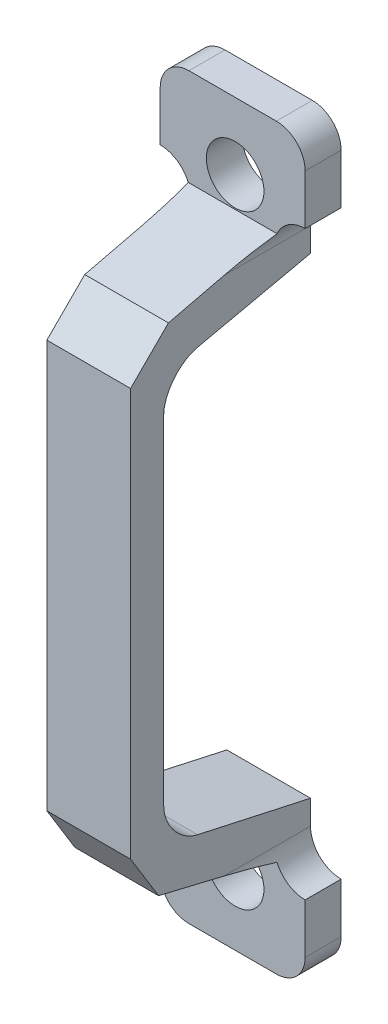
ISO-10303-21;
HEADER;
FILE_DESCRIPTION(('STEP AP214'),'2;1');
FILE_NAME('part.step','',(''),(''),'','','');
FILE_SCHEMA(('AUTOMOTIVE_DESIGN { 1 0 10303 214 1 1 1 1 }'));
ENDSEC;
DATA;
#1=APPLICATION_CONTEXT('core data for automotive mechanical design processes');
#2=APPLICATION_PROTOCOL_DEFINITION('international standard','automotive_design',2000,#1);
#3=PRODUCT_CONTEXT('',#1,'mechanical');
#4=PRODUCT('Part','Part','',(#3));
#5=PRODUCT_RELATED_PRODUCT_CATEGORY('part','',(#4));
#6=PRODUCT_DEFINITION_FORMATION('','',#4);
#7=PRODUCT_DEFINITION_CONTEXT('part definition',#1,'design');
#8=PRODUCT_DEFINITION('design','',#6,#7);
#9=PRODUCT_DEFINITION_SHAPE('','',#8);
#10=(LENGTH_UNIT() NAMED_UNIT(*) SI_UNIT(.MILLI.,.METRE.));
#11=(NAMED_UNIT(*) PLANE_ANGLE_UNIT() SI_UNIT($,.RADIAN.));
#12=(NAMED_UNIT(*) SI_UNIT($,.STERADIAN.) SOLID_ANGLE_UNIT());
#13=UNCERTAINTY_MEASURE_WITH_UNIT(LENGTH_MEASURE(1.E-05),#10,'distance_accuracy_value','');
#14=(GEOMETRIC_REPRESENTATION_CONTEXT(3) GLOBAL_UNCERTAINTY_ASSIGNED_CONTEXT((#13)) GLOBAL_UNIT_ASSIGNED_CONTEXT((#10,
#11,#12)) REPRESENTATION_CONTEXT('',''));
#15=CARTESIAN_POINT('',(0.,0.,0.));
#16=DIRECTION('',(0.,0.,1.));
#17=DIRECTION('',(1.,0.,0.));
#18=AXIS2_PLACEMENT_3D('',#15,#16,#17);
#19=CARTESIAN_POINT('',(89.4859388192383,-29.3519291826514,2.5));
#20=DIRECTION('',(-1.,0.,0.));
#21=DIRECTION('',(0.,0.,1.));
#22=AXIS2_PLACEMENT_3D('',#19,#20,#21);
#23=PLANE('',#22);
#24=DIRECTION('',(0.,1.,0.));
#25=VECTOR('',#24,1.);
#26=CARTESIAN_POINT('',(89.4859388192383,-29.3519291826514,0.));
#27=LINE('',#26,#25);
#28=CARTESIAN_POINT('',(89.4859388192383,-34.8147763907918,0.));
#29=VERTEX_POINT('',#28);
#30=CARTESIAN_POINT('',(89.4859388192383,-31.3519291826514,0.));
#31=VERTEX_POINT('',#30);
#32=EDGE_CURVE('E392',#29,#31,#27,.T.);
#33=ORIENTED_EDGE('',*,*,#32,.T.);
#34=DIRECTION('',(0.,0.,-1.));
#35=VECTOR('',#34,1.);
#36=CARTESIAN_POINT('',(89.4859388192383,-31.3519291826514,2.5));
#37=LINE('',#36,#35);
#38=CARTESIAN_POINT('',(89.4859388192383,-31.3519291826514,2.5));
#39=VERTEX_POINT('',#38);
#40=EDGE_CURVE('E541',#31,#39,#37,.F.);
#41=ORIENTED_EDGE('',*,*,#40,.T.);
#42=DIRECTION('',(0.,1.,0.));
#43=VECTOR('',#42,1.);
#44=CARTESIAN_POINT('',(89.4859388192383,-29.3519291826514,2.5));
#45=LINE('',#44,#43);
#46=CARTESIAN_POINT('',(89.4859388192383,-34.8147763907918,2.5));
#47=VERTEX_POINT('',#46);
#48=EDGE_CURVE('E398',#47,#39,#45,.T.);
#49=ORIENTED_EDGE('',*,*,#48,.F.);
#50=DIRECTION('',(0.,0.,1.));
#51=VECTOR('',#50,1.);
#52=CARTESIAN_POINT('',(89.4859388192383,-34.8147763907918,0.));
#53=LINE('',#52,#51);
#54=EDGE_CURVE('E362',#47,#29,#53,.F.);
#55=ORIENTED_EDGE('',*,*,#54,.T.);
#56=EDGE_LOOP('',(#33,#41,#49,#55));
#57=FACE_BOUND('',#56,.T.);
#58=ADVANCED_FACE('F41',(#57),#23,.F.);
#59=CARTESIAN_POINT('',(79.4177304575605,-29.3519291826514,2.5));
#60=DIRECTION('',(1.,0.,0.));
#61=DIRECTION('',(0.,0.,-1.));
#62=AXIS2_PLACEMENT_3D('',#59,#60,#61);
#63=PLANE('',#62);
#64=DIRECTION('',(0.,-1.,0.));
#65=VECTOR('',#64,1.);
#66=CARTESIAN_POINT('',(79.4177304575605,-29.3519291826514,2.5));
#67=LINE('',#66,#65);
#68=CARTESIAN_POINT('',(79.4177304575605,-31.3519291826514,2.5));
#69=VERTEX_POINT('',#68);
#70=CARTESIAN_POINT('',(79.4177304575605,-34.8147763907918,2.5));
#71=VERTEX_POINT('',#70);
#72=EDGE_CURVE('E402',#69,#71,#67,.T.);
#73=ORIENTED_EDGE('',*,*,#72,.F.);
#74=DIRECTION('',(0.,0.,-1.));
#75=VECTOR('',#74,1.);
#76=CARTESIAN_POINT('',(79.4177304575605,-31.3519291826514,2.5));
#77=LINE('',#76,#75);
#78=CARTESIAN_POINT('',(79.4177304575605,-31.3519291826514,0.));
#79=VERTEX_POINT('',#78);
#80=EDGE_CURVE('E547',#69,#79,#77,.T.);
#81=ORIENTED_EDGE('',*,*,#80,.T.);
#82=DIRECTION('',(0.,-1.,0.));
#83=VECTOR('',#82,1.);
#84=CARTESIAN_POINT('',(79.4177304575605,-29.3519291826514,0.));
#85=LINE('',#84,#83);
#86=CARTESIAN_POINT('',(79.4177304575605,-34.8147763907918,0.));
#87=VERTEX_POINT('',#86);
#88=EDGE_CURVE('E413',#79,#87,#85,.T.);
#89=ORIENTED_EDGE('',*,*,#88,.T.);
#90=DIRECTION('',(0.,0.,1.));
#91=VECTOR('',#90,1.);
#92=CARTESIAN_POINT('',(79.4177304575605,-34.8147763907918,0.));
#93=LINE('',#92,#91);
#94=EDGE_CURVE('E368',#87,#71,#93,.T.);
#95=ORIENTED_EDGE('',*,*,#94,.T.);
#96=EDGE_LOOP('',(#73,#81,#89,#95));
#97=FACE_BOUND('',#96,.T.);
#98=ADVANCED_FACE('F670',(#97),#63,.F.);
#99=CARTESIAN_POINT('',(0.,0.,0.));
#100=DIRECTION('',(0.,0.,1.));
#101=DIRECTION('',(1.,0.,0.));
#102=AXIS2_PLACEMENT_3D('',#99,#100,#101);
#103=PLANE('',#102);
#104=CARTESIAN_POINT('',(84.6238698537211,-34.0071015964445,0.));
#105=DIRECTION('',(0.,0.,1.));
#106=DIRECTION('',(1.,0.,0.));
#107=AXIS2_PLACEMENT_3D('',#104,#105,#106);
#108=CIRCLE('',#107,2.);
#109=CARTESIAN_POINT('',(86.6238698537211,-34.0071015964445,0.));
#110=VERTEX_POINT('',#109);
#111=EDGE_CURVE('E386',#110,#110,#108,.T.);
#112=ORIENTED_EDGE('',*,*,#111,.T.);
#113=EDGE_LOOP('',(#112));
#114=FACE_BOUND('',#113,.T.);
#115=DIRECTION('',(-1.,0.,0.));
#116=VECTOR('',#115,1.);
#117=CARTESIAN_POINT('',(79.4177304575605,-29.3519291826514,0.));
#118=LINE('',#117,#116);
#119=CARTESIAN_POINT('',(87.4859388192383,-29.3519291826514,0.));
#120=VERTEX_POINT('',#119);
#121=CARTESIAN_POINT('',(81.4177304575605,-29.3519291826514,0.));
#122=VERTEX_POINT('',#121);
#123=EDGE_CURVE('E410',#120,#122,#118,.T.);
#124=ORIENTED_EDGE('',*,*,#123,.F.);
#125=CARTESIAN_POINT('',(87.4859388192383,-31.3519291826514,0.));
#126=DIRECTION('',(0.,0.,1.));
#127=DIRECTION('',(1.,0.,0.));
#128=AXIS2_PLACEMENT_3D('',#125,#126,#127);
#129=CIRCLE('',#128,2.);
#130=EDGE_CURVE('E539',#120,#31,#129,.F.);
#131=ORIENTED_EDGE('',*,*,#130,.T.);
#132=ORIENTED_EDGE('',*,*,#32,.F.);
#133=CARTESIAN_POINT('',(89.4859388192383,-36.9414869075612,0.));
#134=DIRECTION('',(0.,0.,1.));
#135=DIRECTION('',(-1.,0.,0.));
#136=AXIS2_PLACEMENT_3D('',#133,#134,#135);
#137=CIRCLE('',#136,2.12671051676938);
#138=CARTESIAN_POINT('',(87.3592283024689,-36.9414869075612,0.));
#139=VERTEX_POINT('',#138);
#140=EDGE_CURVE('E264',#29,#139,#137,.T.);
#141=ORIENTED_EDGE('',*,*,#140,.T.);
#142=DIRECTION('',(0.,-1.,0.));
#143=VECTOR('',#142,1.);
#144=CARTESIAN_POINT('',(87.3592283024689,-36.9414869075612,0.));
#145=LINE('',#144,#143);
#146=CARTESIAN_POINT('',(87.3592283024689,-38.6188905082452,0.));
#147=VERTEX_POINT('',#146);
#148=EDGE_CURVE('E268',#139,#147,#145,.T.);
#149=ORIENTED_EDGE('',*,*,#148,.T.);
#150=DIRECTION('',(1.,0.,0.));
#151=VECTOR('',#150,1.);
#152=CARTESIAN_POINT('',(79.4177304575605,-38.6188905082452,0.));
#153=LINE('',#152,#151);
#154=CARTESIAN_POINT('',(81.5444409743299,-38.6188905082452,0.));
#155=VERTEX_POINT('',#154);
#156=EDGE_CURVE('E372',#155,#147,#153,.T.);
#157=ORIENTED_EDGE('',*,*,#156,.F.);
#158=DIRECTION('',(0.,1.,0.));
#159=VECTOR('',#158,1.);
#160=CARTESIAN_POINT('',(81.5444409743299,-36.9414869075612,0.));
#161=LINE('',#160,#159);
#162=CARTESIAN_POINT('',(81.5444409743299,-36.9414869075612,0.));
#163=VERTEX_POINT('',#162);
#164=EDGE_CURVE('E246',#155,#163,#161,.T.);
#165=ORIENTED_EDGE('',*,*,#164,.T.);
#166=CARTESIAN_POINT('',(79.4177304575605,-36.9414869075612,0.));
#167=DIRECTION('',(0.,0.,1.));
#168=DIRECTION('',(1.,0.,0.));
#169=AXIS2_PLACEMENT_3D('',#166,#167,#168);
#170=CIRCLE('',#169,2.12671051676938);
#171=EDGE_CURVE('E254',#163,#87,#170,.T.);
#172=ORIENTED_EDGE('',*,*,#171,.T.);
#173=ORIENTED_EDGE('',*,*,#88,.F.);
#174=CARTESIAN_POINT('',(81.4177304575605,-31.3519291826514,0.));
#175=DIRECTION('',(0.,0.,1.));
#176=DIRECTION('',(1.,0.,0.));
#177=AXIS2_PLACEMENT_3D('',#174,#175,#176);
#178=CIRCLE('',#177,2.);
#179=EDGE_CURVE('E537',#79,#122,#178,.F.);
#180=ORIENTED_EDGE('',*,*,#179,.T.);
#181=EDGE_LOOP('',(#124,#131,#132,#141,#149,#157,#165,#172,#173,#180));
#182=FACE_BOUND('',#181,.T.);
#183=ADVANCED_FACE('F676',(#114,#182),#103,.F.);
#184=CARTESIAN_POINT('',(0.,0.,2.5));
#185=DIRECTION('',(0.,0.,1.));
#186=DIRECTION('',(1.,0.,0.));
#187=AXIS2_PLACEMENT_3D('',#184,#185,#186);
#188=PLANE('',#187);
#189=ORIENTED_EDGE('',*,*,#48,.T.);
#190=CARTESIAN_POINT('',(87.4859388192383,-31.3519291826514,2.5));
#191=DIRECTION('',(0.,0.,1.));
#192=DIRECTION('',(1.,0.,0.));
#193=AXIS2_PLACEMENT_3D('',#190,#191,#192);
#194=CIRCLE('',#193,2.);
#195=CARTESIAN_POINT('',(87.4859388192383,-29.3519291826514,2.5));
#196=VERTEX_POINT('',#195);
#197=EDGE_CURVE('E545',#39,#196,#194,.T.);
#198=ORIENTED_EDGE('',*,*,#197,.T.);
#199=DIRECTION('',(-1.,0.,0.));
#200=VECTOR('',#199,1.);
#201=CARTESIAN_POINT('',(79.4177304575605,-29.3519291826514,2.5));
#202=LINE('',#201,#200);
#203=CARTESIAN_POINT('',(81.4177304575605,-29.3519291826514,2.5));
#204=VERTEX_POINT('',#203);
#205=EDGE_CURVE('E397',#196,#204,#202,.T.);
#206=ORIENTED_EDGE('',*,*,#205,.T.);
#207=CARTESIAN_POINT('',(81.4177304575605,-31.3519291826514,2.5));
#208=DIRECTION('',(0.,0.,1.));
#209=DIRECTION('',(1.,0.,0.));
#210=AXIS2_PLACEMENT_3D('',#207,#208,#209);
#211=CIRCLE('',#210,2.);
#212=EDGE_CURVE('E543',#204,#69,#211,.T.);
#213=ORIENTED_EDGE('',*,*,#212,.T.);
#214=ORIENTED_EDGE('',*,*,#72,.T.);
#215=CARTESIAN_POINT('',(79.4177304575605,-36.9414869075612,2.5));
#216=DIRECTION('',(0.,0.,1.));
#217=DIRECTION('',(1.,0.,0.));
#218=AXIS2_PLACEMENT_3D('',#215,#216,#217);
#219=CIRCLE('',#218,2.12671051676938);
#220=CARTESIAN_POINT('',(81.3706141552902,-36.0993806878484,2.5));
#221=VERTEX_POINT('',#220);
#222=EDGE_CURVE('E365',#221,#71,#219,.T.);
#223=ORIENTED_EDGE('',*,*,#222,.F.);
#224=DIRECTION('',(1.,0.,0.));
#225=VECTOR('',#224,1.);
#226=CARTESIAN_POINT('',(40.302418368438,-36.0993806878484,2.5));
#227=LINE('',#226,#225);
#228=CARTESIAN_POINT('',(87.5330551215085,-36.0993806878484,2.5));
#229=VERTEX_POINT('',#228);
#230=EDGE_CURVE('E377',#221,#229,#227,.T.);
#231=ORIENTED_EDGE('',*,*,#230,.T.);
#232=CARTESIAN_POINT('',(89.4859388192383,-36.9414869075612,2.5));
#233=DIRECTION('',(0.,0.,1.));
#234=DIRECTION('',(1.,0.,0.));
#235=AXIS2_PLACEMENT_3D('',#232,#233,#234);
#236=CIRCLE('',#235,2.12671051676938);
#237=EDGE_CURVE('E360',#47,#229,#236,.T.);
#238=ORIENTED_EDGE('',*,*,#237,.F.);
#239=EDGE_LOOP('',(#189,#198,#206,#213,#214,#223,#231,#238));
#240=FACE_BOUND('',#239,.T.);
#241=CARTESIAN_POINT('',(84.6238698537211,-34.0071015964445,2.5));
#242=DIRECTION('',(0.,0.,1.));
#243=DIRECTION('',(1.,0.,0.));
#244=AXIS2_PLACEMENT_3D('',#241,#242,#243);
#245=CIRCLE('',#244,2.);
#246=CARTESIAN_POINT('',(86.6238698537211,-34.0071015964445,2.5));
#247=VERTEX_POINT('',#246);
#248=EDGE_CURVE('E389',#247,#247,#245,.T.);
#249=ORIENTED_EDGE('',*,*,#248,.F.);
#250=EDGE_LOOP('',(#249));
#251=FACE_BOUND('',#250,.T.);
#252=ADVANCED_FACE('F725',(#240,#251),#188,.T.);
#253=DIRECTION('',(1.,0.,0.));
#254=VECTOR('',#253,1.);
#255=CARTESIAN_POINT('',(79.4177304575605,-80.6622740102376,2.5));
#256=LINE('',#255,#254);
#257=CARTESIAN_POINT('',(81.4177304575605,-80.6622740102376,2.5));
#258=VERTEX_POINT('',#257);
#259=CARTESIAN_POINT('',(87.4859388192383,-80.6622740102376,2.5));
#260=VERTEX_POINT('',#259);
#261=EDGE_CURVE('E404',#258,#260,#256,.T.);
#262=ORIENTED_EDGE('',*,*,#261,.T.);
#263=CARTESIAN_POINT('',(87.4859388192383,-78.6622740102376,2.5));
#264=DIRECTION('',(0.,0.,1.));
#265=DIRECTION('',(1.,0.,0.));
#266=AXIS2_PLACEMENT_3D('',#263,#264,#265);
#267=CIRCLE('',#266,2.);
#268=CARTESIAN_POINT('',(89.4859388192383,-78.6622740102376,2.5));
#269=VERTEX_POINT('',#268);
#270=EDGE_CURVE('E528',#260,#269,#267,.T.);
#271=ORIENTED_EDGE('',*,*,#270,.T.);
#272=CARTESIAN_POINT('',(89.4859388192383,-75.1994268020973,2.5));
#273=VERTEX_POINT('',#272);
#274=EDGE_CURVE('E395',#269,#273,#45,.T.);
#275=ORIENTED_EDGE('',*,*,#274,.T.);
#276=CARTESIAN_POINT('',(89.4859388192383,-73.0727162853279,2.5));
#277=DIRECTION('',(0.,0.,1.));
#278=DIRECTION('',(1.,0.,0.));
#279=AXIS2_PLACEMENT_3D('',#276,#277,#278);
#280=CIRCLE('',#279,2.12671051676938);
#281=CARTESIAN_POINT('',(87.5330551215086,-73.9148225050407,2.5));
#282=VERTEX_POINT('',#281);
#283=EDGE_CURVE('E350',#282,#273,#280,.T.);
#284=ORIENTED_EDGE('',*,*,#283,.F.);
#285=DIRECTION('',(1.,0.,0.));
#286=VECTOR('',#285,1.);
#287=CARTESIAN_POINT('',(40.302418368438,-73.9148225050407,2.5));
#288=LINE('',#287,#286);
#289=CARTESIAN_POINT('',(81.3706141552902,-73.9148225050407,2.5));
#290=VERTEX_POINT('',#289);
#291=EDGE_CURVE('E375',#290,#282,#288,.T.);
#292=ORIENTED_EDGE('',*,*,#291,.F.);
#293=CARTESIAN_POINT('',(79.4177304575605,-73.0727162853279,2.5));
#294=DIRECTION('',(0.,0.,1.));
#295=DIRECTION('',(1.,0.,0.));
#296=AXIS2_PLACEMENT_3D('',#293,#294,#295);
#297=CIRCLE('',#296,2.12671051676938);
#298=CARTESIAN_POINT('',(79.4177304575605,-75.1994268020973,2.5));
#299=VERTEX_POINT('',#298);
#300=EDGE_CURVE('E356',#299,#290,#297,.T.);
#301=ORIENTED_EDGE('',*,*,#300,.F.);
#302=CARTESIAN_POINT('',(79.4177304575605,-78.6622740102376,2.5));
#303=VERTEX_POINT('',#302);
#304=EDGE_CURVE('E401',#299,#303,#67,.T.);
#305=ORIENTED_EDGE('',*,*,#304,.T.);
#306=CARTESIAN_POINT('',(81.4177304575605,-78.6622740102376,2.5));
#307=DIRECTION('',(0.,0.,1.));
#308=DIRECTION('',(1.,0.,0.));
#309=AXIS2_PLACEMENT_3D('',#306,#307,#308);
#310=CIRCLE('',#309,2.);
#311=EDGE_CURVE('E526',#303,#258,#310,.T.);
#312=ORIENTED_EDGE('',*,*,#311,.T.);
#313=EDGE_LOOP('',(#262,#271,#275,#284,#292,#301,#305,#312));
#314=FACE_BOUND('',#313,.T.);
#315=CARTESIAN_POINT('',(84.6238698537211,-76.0071015964445,2.5));
#316=DIRECTION('',(0.,0.,1.));
#317=DIRECTION('',(1.,0.,0.));
#318=AXIS2_PLACEMENT_3D('',#315,#316,#317);
#319=CIRCLE('',#318,2.);
#320=CARTESIAN_POINT('',(86.6238698537211,-76.0071015964445,2.5));
#321=VERTEX_POINT('',#320);
#322=EDGE_CURVE('E383',#321,#321,#319,.T.);
#323=ORIENTED_EDGE('',*,*,#322,.F.);
#324=EDGE_LOOP('',(#323));
#325=FACE_BOUND('',#324,.T.);
#326=ADVANCED_FACE('F690',(#314,#325),#188,.T.);
#327=CARTESIAN_POINT('',(89.4859388192383,-78.6622740102376,0.));
#328=VERTEX_POINT('',#327);
#329=CARTESIAN_POINT('',(89.4859388192383,-75.1994268020973,0.));
#330=VERTEX_POINT('',#329);
#331=EDGE_CURVE('E408',#328,#330,#27,.T.);
#332=ORIENTED_EDGE('',*,*,#331,.F.);
#333=CARTESIAN_POINT('',(87.4859388192383,-78.6622740102376,0.));
#334=DIRECTION('',(0.,0.,1.));
#335=DIRECTION('',(1.,0.,0.));
#336=AXIS2_PLACEMENT_3D('',#333,#334,#335);
#337=CIRCLE('',#336,2.);
#338=CARTESIAN_POINT('',(87.4859388192383,-80.6622740102376,0.));
#339=VERTEX_POINT('',#338);
#340=EDGE_CURVE('E519',#328,#339,#337,.F.);
#341=ORIENTED_EDGE('',*,*,#340,.T.);
#342=DIRECTION('',(1.,0.,0.));
#343=VECTOR('',#342,1.);
#344=CARTESIAN_POINT('',(79.4177304575605,-80.6622740102376,0.));
#345=LINE('',#344,#343);
#346=CARTESIAN_POINT('',(81.4177304575605,-80.6622740102376,0.));
#347=VERTEX_POINT('',#346);
#348=EDGE_CURVE('E415',#347,#339,#345,.T.);
#349=ORIENTED_EDGE('',*,*,#348,.F.);
#350=CARTESIAN_POINT('',(81.4177304575605,-78.6622740102376,0.));
#351=DIRECTION('',(0.,0.,1.));
#352=DIRECTION('',(1.,0.,0.));
#353=AXIS2_PLACEMENT_3D('',#350,#351,#352);
#354=CIRCLE('',#353,2.);
#355=CARTESIAN_POINT('',(79.4177304575605,-78.6622740102376,0.));
#356=VERTEX_POINT('',#355);
#357=EDGE_CURVE('E517',#347,#356,#354,.F.);
#358=ORIENTED_EDGE('',*,*,#357,.T.);
#359=CARTESIAN_POINT('',(79.4177304575605,-75.1994268020973,0.));
#360=VERTEX_POINT('',#359);
#361=EDGE_CURVE('E253',#360,#356,#85,.T.);
#362=ORIENTED_EDGE('',*,*,#361,.F.);
#363=CARTESIAN_POINT('',(79.4177304575605,-73.0727162853279,0.));
#364=DIRECTION('',(0.,0.,1.));
#365=DIRECTION('',(1.,0.,0.));
#366=AXIS2_PLACEMENT_3D('',#363,#364,#365);
#367=CIRCLE('',#366,2.12671051676938);
#368=CARTESIAN_POINT('',(81.5444409743299,-73.0727162853279,0.));
#369=VERTEX_POINT('',#368);
#370=EDGE_CURVE('E231',#360,#369,#367,.T.);
#371=ORIENTED_EDGE('',*,*,#370,.T.);
#372=CARTESIAN_POINT('',(81.5444409743299,-71.3953126846439,0.));
#373=VERTEX_POINT('',#372);
#374=EDGE_CURVE('E237',#369,#373,#161,.T.);
#375=ORIENTED_EDGE('',*,*,#374,.T.);
#376=DIRECTION('',(1.,0.,0.));
#377=VECTOR('',#376,1.);
#378=CARTESIAN_POINT('',(79.4177304575605,-71.3953126846439,0.));
#379=LINE('',#378,#377);
#380=CARTESIAN_POINT('',(87.3592283024689,-71.3953126846439,0.));
#381=VERTEX_POINT('',#380);
#382=EDGE_CURVE('E371',#373,#381,#379,.T.);
#383=ORIENTED_EDGE('',*,*,#382,.T.);
#384=CARTESIAN_POINT('',(87.3592283024689,-73.0727162853279,0.));
#385=VERTEX_POINT('',#384);
#386=EDGE_CURVE('E267',#381,#385,#145,.T.);
#387=ORIENTED_EDGE('',*,*,#386,.T.);
#388=CARTESIAN_POINT('',(89.4859388192383,-73.0727162853279,0.));
#389=DIRECTION('',(0.,0.,1.));
#390=DIRECTION('',(-1.,0.,0.));
#391=AXIS2_PLACEMENT_3D('',#388,#389,#390);
#392=CIRCLE('',#391,2.12671051676938);
#393=EDGE_CURVE('E271',#385,#330,#392,.T.);
#394=ORIENTED_EDGE('',*,*,#393,.T.);
#395=EDGE_LOOP('',(#332,#341,#349,#358,#362,#371,#375,#383,#387,#394));
#396=FACE_BOUND('',#395,.T.);
#397=CARTESIAN_POINT('',(84.6238698537211,-76.0071015964445,0.));
#398=DIRECTION('',(0.,0.,1.));
#399=DIRECTION('',(1.,0.,0.));
#400=AXIS2_PLACEMENT_3D('',#397,#398,#399);
#401=CIRCLE('',#400,2.);
#402=CARTESIAN_POINT('',(86.6238698537211,-76.0071015964445,0.));
#403=VERTEX_POINT('',#402);
#404=EDGE_CURVE('E380',#403,#403,#401,.T.);
#405=ORIENTED_EDGE('',*,*,#404,.T.);
#406=EDGE_LOOP('',(#405));
#407=FACE_BOUND('',#406,.T.);
#408=ADVANCED_FACE('F250',(#396,#407),#103,.F.);
#409=ORIENTED_EDGE('',*,*,#274,.F.);
#410=DIRECTION('',(0.,0.,-1.));
#411=VECTOR('',#410,1.);
#412=CARTESIAN_POINT('',(89.4859388192383,-78.6622740102376,2.5));
#413=LINE('',#412,#411);
#414=EDGE_CURVE('E448',#269,#328,#413,.T.);
#415=ORIENTED_EDGE('',*,*,#414,.T.);
#416=ORIENTED_EDGE('',*,*,#331,.T.);
#417=DIRECTION('',(0.,0.,1.));
#418=VECTOR('',#417,1.);
#419=CARTESIAN_POINT('',(89.4859388192383,-75.1994268020973,0.));
#420=LINE('',#419,#418);
#421=EDGE_CURVE('E353',#330,#273,#420,.T.);
#422=ORIENTED_EDGE('',*,*,#421,.T.);
#423=EDGE_LOOP('',(#409,#415,#416,#422));
#424=FACE_BOUND('',#423,.T.);
#425=ADVANCED_FACE('F672',(#424),#23,.F.);
#426=CARTESIAN_POINT('',(79.4177304575605,-29.3519291826514,2.5));
#427=DIRECTION('',(0.,-1.,0.));
#428=DIRECTION('',(0.,0.,-1.));
#429=AXIS2_PLACEMENT_3D('',#426,#427,#428);
#430=PLANE('',#429);
#431=ORIENTED_EDGE('',*,*,#205,.F.);
#432=DIRECTION('',(0.,0.,-1.));
#433=VECTOR('',#432,1.);
#434=CARTESIAN_POINT('',(87.4859388192383,-29.3519291826514,2.5));
#435=LINE('',#434,#433);
#436=EDGE_CURVE('E534',#196,#120,#435,.T.);
#437=ORIENTED_EDGE('',*,*,#436,.T.);
#438=ORIENTED_EDGE('',*,*,#123,.T.);
#439=DIRECTION('',(0.,0.,-1.));
#440=VECTOR('',#439,1.);
#441=CARTESIAN_POINT('',(81.4177304575605,-29.3519291826514,2.5));
#442=LINE('',#441,#440);
#443=EDGE_CURVE('E532',#122,#204,#442,.F.);
#444=ORIENTED_EDGE('',*,*,#443,.T.);
#445=EDGE_LOOP('',(#431,#437,#438,#444));
#446=FACE_BOUND('',#445,.T.);
#447=ADVANCED_FACE('F683',(#446),#430,.F.);
#448=ORIENTED_EDGE('',*,*,#361,.T.);
#449=DIRECTION('',(0.,0.,-1.));
#450=VECTOR('',#449,1.);
#451=CARTESIAN_POINT('',(79.4177304575605,-78.6622740102376,2.5));
#452=LINE('',#451,#450);
#453=EDGE_CURVE('E530',#356,#303,#452,.F.);
#454=ORIENTED_EDGE('',*,*,#453,.T.);
#455=ORIENTED_EDGE('',*,*,#304,.F.);
#456=DIRECTION('',(0.,0.,1.));
#457=VECTOR('',#456,1.);
#458=CARTESIAN_POINT('',(79.4177304575605,-75.1994268020973,0.));
#459=LINE('',#458,#457);
#460=EDGE_CURVE('E358',#299,#360,#459,.F.);
#461=ORIENTED_EDGE('',*,*,#460,.T.);
#462=EDGE_LOOP('',(#448,#454,#455,#461));
#463=FACE_BOUND('',#462,.T.);
#464=ADVANCED_FACE('F679',(#463),#63,.F.);
#465=CARTESIAN_POINT('',(79.4177304575605,-80.6622740102376,2.5));
#466=DIRECTION('',(0.,1.,0.));
#467=DIRECTION('',(0.,0.,1.));
#468=AXIS2_PLACEMENT_3D('',#465,#466,#467);
#469=PLANE('',#468);
#470=ORIENTED_EDGE('',*,*,#348,.T.);
#471=DIRECTION('',(0.,0.,-1.));
#472=VECTOR('',#471,1.);
#473=CARTESIAN_POINT('',(87.4859388192383,-80.6622740102376,2.5));
#474=LINE('',#473,#472);
#475=EDGE_CURVE('E524',#339,#260,#474,.F.);
#476=ORIENTED_EDGE('',*,*,#475,.T.);
#477=ORIENTED_EDGE('',*,*,#261,.F.);
#478=DIRECTION('',(0.,0.,-1.));
#479=VECTOR('',#478,1.);
#480=CARTESIAN_POINT('',(81.4177304575605,-80.6622740102376,2.5));
#481=LINE('',#480,#479);
#482=EDGE_CURVE('E521',#258,#347,#481,.T.);
#483=ORIENTED_EDGE('',*,*,#482,.T.);
#484=EDGE_LOOP('',(#470,#476,#477,#483));
#485=FACE_BOUND('',#484,.T.);
#486=ADVANCED_FACE('F702',(#485),#469,.F.);
#487=CARTESIAN_POINT('',(84.6238698537211,-34.0071015964445,2.5));
#488=DIRECTION('',(0.,0.,-1.));
#489=DIRECTION('',(-1.,0.,0.));
#490=AXIS2_PLACEMENT_3D('',#487,#488,#489);
#491=CYLINDRICAL_SURFACE('',#490,2.);
#492=ORIENTED_EDGE('',*,*,#248,.T.);
#493=EDGE_LOOP('',(#492));
#494=FACE_BOUND('',#493,.T.);
#495=ORIENTED_EDGE('',*,*,#111,.F.);
#496=EDGE_LOOP('',(#495));
#497=FACE_BOUND('',#496,.T.);
#498=ADVANCED_FACE('F830',(#494,#497),#491,.F.);
#499=CARTESIAN_POINT('',(84.6238698537211,-76.0071015964445,2.5));
#500=DIRECTION('',(0.,0.,-1.));
#501=DIRECTION('',(-1.,0.,0.));
#502=AXIS2_PLACEMENT_3D('',#499,#500,#501);
#503=CYLINDRICAL_SURFACE('',#502,2.);
#504=ORIENTED_EDGE('',*,*,#322,.T.);
#505=EDGE_LOOP('',(#504));
#506=FACE_BOUND('',#505,.T.);
#507=ORIENTED_EDGE('',*,*,#404,.F.);
#508=EDGE_LOOP('',(#507));
#509=FACE_BOUND('',#508,.T.);
#510=ADVANCED_FACE('F825',(#506,#509),#503,.F.);
#511=CARTESIAN_POINT('',(40.302418368438,-38.4970321387793,12.5));
#512=DIRECTION('',(0.,0.,1.));
#513=DIRECTION('',(0.,-1.,0.));
#514=AXIS2_PLACEMENT_3D('',#511,#512,#513);
#515=PLANE('',#514);
#516=DIRECTION('',(0.,-1.,0.));
#517=VECTOR('',#516,1.);
#518=CARTESIAN_POINT('',(87.3592283024689,-38.4970321387793,12.5));
#519=LINE('',#518,#517);
#520=CARTESIAN_POINT('',(87.3592283024689,-40.4970321387793,12.5));
#521=VERTEX_POINT('',#520);
#522=CARTESIAN_POINT('',(87.3592283024689,-68.8118438239469,12.5));
#523=VERTEX_POINT('',#522);
#524=EDGE_CURVE('E576',#521,#523,#519,.T.);
#525=ORIENTED_EDGE('',*,*,#524,.F.);
#526=DIRECTION('',(-1.,0.,0.));
#527=VECTOR('',#526,1.);
#528=CARTESIAN_POINT('',(40.302418368438,-40.4970321387793,12.5));
#529=LINE('',#528,#527);
#530=CARTESIAN_POINT('',(81.5444409743299,-40.4970321387793,12.5));
#531=VERTEX_POINT('',#530);
#532=EDGE_CURVE('E62',#521,#531,#529,.T.);
#533=ORIENTED_EDGE('',*,*,#532,.T.);
#534=DIRECTION('',(0.,1.,0.));
#535=VECTOR('',#534,1.);
#536=CARTESIAN_POINT('',(81.5444409743299,-38.4970321387793,12.5));
#537=LINE('',#536,#535);
#538=CARTESIAN_POINT('',(81.5444409743299,-68.8118438239469,12.5));
#539=VERTEX_POINT('',#538);
#540=EDGE_CURVE('E346',#539,#531,#537,.T.);
#541=ORIENTED_EDGE('',*,*,#540,.F.);
#542=DIRECTION('',(1.,0.,0.));
#543=VECTOR('',#542,1.);
#544=CARTESIAN_POINT('',(40.302418368438,-68.8118438239469,12.5));
#545=LINE('',#544,#543);
#546=EDGE_CURVE('E557',#539,#523,#545,.T.);
#547=ORIENTED_EDGE('',*,*,#546,.T.);
#548=EDGE_LOOP('',(#525,#533,#541,#547));
#549=FACE_BOUND('',#548,.T.);
#550=ADVANCED_FACE('F578',(#549),#515,.T.);
#551=CARTESIAN_POINT('',(40.302418368438,-36.0993806878484,2.5));
#552=DIRECTION('',(0.,0.972439104499251,0.23315700298446));
#553=DIRECTION('',(0.,-0.23315700298446,0.972439104499251));
#554=AXIS2_PLACEMENT_3D('',#551,#552,#553);
#555=PLANE('',#554);
#556=DIRECTION('',(0.,0.23315700298446,-0.972439104499251));
#557=VECTOR('',#556,1.);
#558=CARTESIAN_POINT('',(81.5444409743299,-36.0993806878484,2.5));
#559=LINE('',#558,#557);
#560=CARTESIAN_POINT('',(81.5444409743299,-37.8662661497023,9.86923401092299));
#561=VERTEX_POINT('',#560);
#562=CARTESIAN_POINT('',(81.5444409743299,-36.9414869075612,6.01221283387893));
#563=VERTEX_POINT('',#562);
#564=EDGE_CURVE('E348',#561,#563,#559,.T.);
#565=ORIENTED_EDGE('',*,*,#564,.F.);
#566=DIRECTION('',(1.,0.,0.));
#567=VECTOR('',#566,1.);
#568=CARTESIAN_POINT('',(40.302418368438,-37.8662661497023,9.86923401092299));
#569=LINE('',#568,#567);
#570=CARTESIAN_POINT('',(87.3592283024689,-37.8662661497023,9.86923401092299));
#571=VERTEX_POINT('',#570);
#572=EDGE_CURVE('E550',#561,#571,#569,.T.);
#573=ORIENTED_EDGE('',*,*,#572,.T.);
#574=DIRECTION('',(0.,-0.23315700298446,0.972439104499251));
#575=VECTOR('',#574,1.);
#576=CARTESIAN_POINT('',(87.3592283024689,-36.0993806878484,2.5));
#577=LINE('',#576,#575);
#578=CARTESIAN_POINT('',(87.3592283024689,-36.9414869075612,6.01221283387893));
#579=VERTEX_POINT('',#578);
#580=EDGE_CURVE('E577',#579,#571,#577,.T.);
#581=ORIENTED_EDGE('',*,*,#580,.F.);
#582=CARTESIAN_POINT('',(89.4859388192383,-36.9414869075612,6.01221283387894));
#583=DIRECTION('',(0.,0.972439104499251,0.23315700298446));
#584=DIRECTION('',(0.,-0.23315700298446,0.972439104499251));
#585=AXIS2_PLACEMENT_3D('',#582,#583,#584);
#586=ELLIPSE('',#585,9.1213666737307,2.12671051676938);
#587=EDGE_CURVE('E717',#229,#579,#586,.T.);
#588=ORIENTED_EDGE('',*,*,#587,.F.);
#589=ORIENTED_EDGE('',*,*,#230,.F.);
#590=CARTESIAN_POINT('',(79.4177304575605,-36.9414869075612,6.01221283387894));
#591=DIRECTION('',(0.,0.972439104499251,0.23315700298446));
#592=DIRECTION('',(0.,-0.23315700298446,0.972439104499251));
#593=AXIS2_PLACEMENT_3D('',#590,#591,#592);
#594=ELLIPSE('',#593,9.1213666737307,2.12671051676938);
#595=EDGE_CURVE('E437',#563,#221,#594,.T.);
#596=ORIENTED_EDGE('',*,*,#595,.F.);
#597=EDGE_LOOP('',(#565,#573,#581,#588,#589,#596));
#598=FACE_BOUND('',#597,.T.);
#599=ADVANCED_FACE('F568',(#598),#555,.T.);
#600=CARTESIAN_POINT('',(40.302418368438,-71.5171710541098,12.5));
#601=DIRECTION('',(0.,-0.972439104499251,0.23315700298446));
#602=DIRECTION('',(0.,-0.23315700298446,-0.972439104499251));
#603=AXIS2_PLACEMENT_3D('',#600,#601,#602);
#604=PLANE('',#603);
#605=DIRECTION('',(0.,-0.23315700298446,-0.972439104499251));
#606=VECTOR('',#605,1.);
#607=CARTESIAN_POINT('',(87.3592283024689,-71.5171710541098,12.5));
#608=LINE('',#607,#606);
#609=CARTESIAN_POINT('',(87.3592283024689,-71.9834850600787,10.5551217910015));
#610=VERTEX_POINT('',#609);
#611=CARTESIAN_POINT('',(87.3592283024689,-73.0727162853279,6.01221283387896));
#612=VERTEX_POINT('',#611);
#613=EDGE_CURVE('E580',#610,#612,#608,.T.);
#614=ORIENTED_EDGE('',*,*,#613,.F.);
#615=DIRECTION('',(-1.,0.,0.));
#616=VECTOR('',#615,1.);
#617=CARTESIAN_POINT('',(40.302418368438,-71.9834850600787,10.5551217910015));
#618=LINE('',#617,#616);
#619=CARTESIAN_POINT('',(81.5444409743299,-71.9834850600787,10.5551217910015));
#620=VERTEX_POINT('',#619);
#621=EDGE_CURVE('E12',#610,#620,#618,.T.);
#622=ORIENTED_EDGE('',*,*,#621,.T.);
#623=DIRECTION('',(0.,0.23315700298446,0.972439104499251));
#624=VECTOR('',#623,1.);
#625=CARTESIAN_POINT('',(81.5444409743299,-71.5171710541098,12.5));
#626=LINE('',#625,#624);
#627=CARTESIAN_POINT('',(81.5444409743299,-73.0727162853279,6.01221283387896));
#628=VERTEX_POINT('',#627);
#629=EDGE_CURVE('E339',#628,#620,#626,.T.);
#630=ORIENTED_EDGE('',*,*,#629,.F.);
#631=CARTESIAN_POINT('',(79.4177304575605,-73.0727162853279,6.01221283387896));
#632=DIRECTION('',(0.,-0.972439104499251,0.23315700298446));
#633=DIRECTION('',(0.,0.23315700298446,0.972439104499251));
#634=AXIS2_PLACEMENT_3D('',#631,#632,#633);
#635=ELLIPSE('',#634,9.12136667373067,2.12671051676938);
#636=EDGE_CURVE('E234',#290,#628,#635,.T.);
#637=ORIENTED_EDGE('',*,*,#636,.F.);
#638=ORIENTED_EDGE('',*,*,#291,.T.);
#639=CARTESIAN_POINT('',(89.4859388192383,-73.0727162853279,6.01221283387896));
#640=DIRECTION('',(0.,-0.972439104499251,0.23315700298446));
#641=DIRECTION('',(0.,0.23315700298446,0.972439104499251));
#642=AXIS2_PLACEMENT_3D('',#639,#640,#641);
#643=ELLIPSE('',#642,9.12136667373067,2.12671051676938);
#644=EDGE_CURVE('E444',#612,#282,#643,.T.);
#645=ORIENTED_EDGE('',*,*,#644,.F.);
#646=EDGE_LOOP('',(#614,#622,#630,#637,#638,#645));
#647=FACE_BOUND('',#646,.T.);
#648=ADVANCED_FACE('F716',(#647),#604,.T.);
#649=CARTESIAN_POINT('',(79.4177304575605,-38.6188905082452,0.));
#650=DIRECTION('',(0.,0.976633494112856,0.214911652026859));
#651=DIRECTION('',(0.,-0.214911652026859,0.976633494112856));
#652=AXIS2_PLACEMENT_3D('',#649,#650,#651);
#653=PLANE('',#652);
#654=DIRECTION('',(0.,-0.214911652026859,0.976633494112856));
#655=VECTOR('',#654,1.);
#656=CARTESIAN_POINT('',(87.3592283024689,-38.6188905082452,0.));
#657=LINE('',#656,#655);
#658=CARTESIAN_POINT('',(87.3592283024689,-40.3448851014713,7.84352134704958));
#659=VERTEX_POINT('',#658);
#660=EDGE_CURVE('E286',#147,#659,#657,.T.);
#661=ORIENTED_EDGE('',*,*,#660,.T.);
#662=CARTESIAN_POINT('',(81.2537016079229,-40.3448851014713,7.84352134704958));
#663=CARTESIAN_POINT('',(83.3857902949073,-40.3448851014713,7.84352134704958));
#664=CARTESIAN_POINT('',(85.5178789818915,-40.3448851014713,7.84352134704958));
#665=CARTESIAN_POINT('',(87.6499676688758,-40.3448851014713,7.84352134704958));
#666=(BOUNDED_CURVE() B_SPLINE_CURVE(3,(#662,#663,#664,#665),.UNSPECIFIED.,.F.,
.F.) B_SPLINE_CURVE_WITH_KNOTS((4,4),(-0.00823223721131533,-0.00183597115036243),
.UNSPECIFIED.) CURVE() GEOMETRIC_REPRESENTATION_ITEM() RATIONAL_B_SPLINE_CURVE((1.,1.,1.,1.)) REPRESENTATION_ITEM(''));
#667=CARTESIAN_POINT('',(81.5444409743299,-40.3448851014713,7.84352134704958));
#668=VERTEX_POINT('',#667);
#669=EDGE_CURVE('E585',#659,#668,#666,.F.);
#670=ORIENTED_EDGE('',*,*,#669,.T.);
#671=DIRECTION('',(0.,0.214911652026859,-0.976633494112856));
#672=VECTOR('',#671,1.);
#673=CARTESIAN_POINT('',(81.5444409743299,-38.6188905082452,0.));
#674=LINE('',#673,#672);
#675=EDGE_CURVE('E331',#668,#155,#674,.T.);
#676=ORIENTED_EDGE('',*,*,#675,.T.);
#677=ORIENTED_EDGE('',*,*,#156,.T.);
#678=EDGE_LOOP('',(#661,#670,#676,#677));
#679=FACE_BOUND('',#678,.T.);
#680=ADVANCED_FACE('F311',(#679),#653,.F.);
#681=CARTESIAN_POINT('',(79.4177304575605,-69.151033694455,10.198786390969));
#682=DIRECTION('',(0.,-0.976633494112856,0.21491165202686));
#683=DIRECTION('',(0.,-0.21491165202686,-0.976633494112856));
#684=AXIS2_PLACEMENT_3D('',#681,#682,#683);
#685=PLANE('',#684);
#686=DIRECTION('',(0.,0.21491165202686,0.976633494112856));
#687=VECTOR('',#686,1.);
#688=CARTESIAN_POINT('',(81.5444409743299,-69.151033694455,10.198786390969));
#689=LINE('',#688,#687);
#690=CARTESIAN_POINT('',(81.5444409743299,-69.6693180914177,7.84352134704959));
#691=VERTEX_POINT('',#690);
#692=EDGE_CURVE('E242',#373,#691,#689,.T.);
#693=ORIENTED_EDGE('',*,*,#692,.T.);
#694=CARTESIAN_POINT('',(87.6499676688758,-69.6693180914177,7.84352134704958));
#695=CARTESIAN_POINT('',(85.5178789818915,-69.6693180914177,7.84352134704958));
#696=CARTESIAN_POINT('',(83.3857902949073,-69.6693180914177,7.84352134704958));
#697=CARTESIAN_POINT('',(81.2537016079229,-69.6693180914177,7.84352134704958));
#698=(BOUNDED_CURVE() B_SPLINE_CURVE(3,(#694,#695,#696,#697),.UNSPECIFIED.,.F.,
.F.) B_SPLINE_CURVE_WITH_KNOTS((4,4),(-0.00823223721131533,-0.00183597115036243),
.UNSPECIFIED.) CURVE() GEOMETRIC_REPRESENTATION_ITEM() RATIONAL_B_SPLINE_CURVE((1.,1.,1.,1.)) REPRESENTATION_ITEM(''));
#699=CARTESIAN_POINT('',(87.3592283024689,-69.6693180914177,7.84352134704958));
#700=VERTEX_POINT('',#699);
#701=EDGE_CURVE('E293',#691,#700,#698,.F.);
#702=ORIENTED_EDGE('',*,*,#701,.T.);
#703=DIRECTION('',(0.,-0.21491165202686,-0.976633494112856));
#704=VECTOR('',#703,1.);
#705=CARTESIAN_POINT('',(87.3592283024689,-69.151033694455,10.198786390969));
#706=LINE('',#705,#704);
#707=EDGE_CURVE('E263',#700,#381,#706,.T.);
#708=ORIENTED_EDGE('',*,*,#707,.T.);
#709=ORIENTED_EDGE('',*,*,#382,.F.);
#710=EDGE_LOOP('',(#693,#702,#708,#709));
#711=FACE_BOUND('',#710,.T.);
#712=ADVANCED_FACE('F300',(#711),#685,.F.);
#713=CARTESIAN_POINT('',(79.4177304575605,-40.863169498434,10.198786390969));
#714=DIRECTION('',(0.,0.,1.));
#715=DIRECTION('',(1.,0.,0.));
#716=AXIS2_PLACEMENT_3D('',#713,#714,#715);
#717=PLANE('',#716);
#718=DIRECTION('',(0.,1.,0.));
#719=VECTOR('',#718,1.);
#720=CARTESIAN_POINT('',(81.5444409743299,-40.863169498434,10.198786390969));
#721=LINE('',#720,#719);
#722=CARTESIAN_POINT('',(81.5444409743299,-66.7394176090791,10.198786390969));
#723=VERTEX_POINT('',#722);
#724=CARTESIAN_POINT('',(81.5444409743299,-43.2747855838099,10.198786390969));
#725=VERTEX_POINT('',#724);
#726=EDGE_CURVE('E425',#723,#725,#721,.T.);
#727=ORIENTED_EDGE('',*,*,#726,.T.);
#728=CARTESIAN_POINT('',(87.6499676688758,-43.2747855838099,10.198786390969));
#729=CARTESIAN_POINT('',(85.5178789818915,-43.2747855838099,10.198786390969));
#730=CARTESIAN_POINT('',(83.3857902949073,-43.2747855838099,10.198786390969));
#731=CARTESIAN_POINT('',(81.2537016079229,-43.2747855838099,10.198786390969));
#732=(BOUNDED_CURVE() B_SPLINE_CURVE(3,(#728,#729,#730,#731),.UNSPECIFIED.,.F.,
.F.) B_SPLINE_CURVE_WITH_KNOTS((4,4),(-0.00823223721131533,-0.00183597115036243),
.UNSPECIFIED.) CURVE() GEOMETRIC_REPRESENTATION_ITEM() RATIONAL_B_SPLINE_CURVE((1.,1.,1.,1.)) REPRESENTATION_ITEM(''));
#733=CARTESIAN_POINT('',(87.3592283024689,-43.2747855838099,10.198786390969));
#734=VERTEX_POINT('',#733);
#735=EDGE_CURVE('E436',#725,#734,#732,.F.);
#736=ORIENTED_EDGE('',*,*,#735,.T.);
#737=DIRECTION('',(0.,-1.,0.));
#738=VECTOR('',#737,1.);
#739=CARTESIAN_POINT('',(87.3592283024689,-40.863169498434,10.198786390969));
#740=LINE('',#739,#738);
#741=CARTESIAN_POINT('',(87.3592283024689,-66.7394176090792,10.198786390969));
#742=VERTEX_POINT('',#741);
#743=EDGE_CURVE('E407',#734,#742,#740,.T.);
#744=ORIENTED_EDGE('',*,*,#743,.T.);
#745=CARTESIAN_POINT('',(81.2537016079229,-66.7394176090791,10.198786390969));
#746=CARTESIAN_POINT('',(83.3857902949073,-66.7394176090791,10.198786390969));
#747=CARTESIAN_POINT('',(85.5178789818915,-66.7394176090791,10.198786390969));
#748=CARTESIAN_POINT('',(87.6499676688758,-66.7394176090791,10.198786390969));
#749=(BOUNDED_CURVE() B_SPLINE_CURVE(3,(#745,#746,#747,#748),.UNSPECIFIED.,.F.,
.F.) B_SPLINE_CURVE_WITH_KNOTS((4,4),(-0.00823223721131533,-0.00183597115036243),
.UNSPECIFIED.) CURVE() GEOMETRIC_REPRESENTATION_ITEM() RATIONAL_B_SPLINE_CURVE((1.,1.,1.,1.)) REPRESENTATION_ITEM(''));
#750=EDGE_CURVE('E429',#742,#723,#749,.F.);
#751=ORIENTED_EDGE('',*,*,#750,.T.);
#752=EDGE_LOOP('',(#727,#736,#744,#751));
#753=FACE_BOUND('',#752,.T.);
#754=ADVANCED_FACE('F310',(#753),#717,.F.);
#755=CARTESIAN_POINT('',(89.4859388192383,-36.9414869075612,0.));
#756=DIRECTION('',(0.,0.,1.));
#757=DIRECTION('',(1.,0.,0.));
#758=AXIS2_PLACEMENT_3D('',#755,#756,#757);
#759=CYLINDRICAL_SURFACE('',#758,2.12671051676938);
#760=ORIENTED_EDGE('',*,*,#237,.T.);
#761=ORIENTED_EDGE('',*,*,#587,.T.);
#762=DIRECTION('',(0.,0.,1.));
#763=VECTOR('',#762,1.);
#764=CARTESIAN_POINT('',(87.3592283024689,-36.9414869075612,0.));
#765=LINE('',#764,#763);
#766=EDGE_CURVE('E274',#139,#579,#765,.T.);
#767=ORIENTED_EDGE('',*,*,#766,.F.);
#768=ORIENTED_EDGE('',*,*,#140,.F.);
#769=ORIENTED_EDGE('',*,*,#54,.F.);
#770=EDGE_LOOP('',(#760,#761,#767,#768,#769));
#771=FACE_BOUND('',#770,.T.);
#772=ADVANCED_FACE('F312',(#771),#759,.F.);
#773=CARTESIAN_POINT('',(89.4859388192383,-73.0727162853279,0.));
#774=DIRECTION('',(0.,0.,1.));
#775=DIRECTION('',(1.,0.,0.));
#776=AXIS2_PLACEMENT_3D('',#773,#774,#775);
#777=CYLINDRICAL_SURFACE('',#776,2.12671051676938);
#778=ORIENTED_EDGE('',*,*,#393,.F.);
#779=DIRECTION('',(0.,0.,1.));
#780=VECTOR('',#779,1.);
#781=CARTESIAN_POINT('',(87.3592283024689,-73.0727162853279,0.));
#782=LINE('',#781,#780);
#783=EDGE_CURVE('E258',#385,#612,#782,.T.);
#784=ORIENTED_EDGE('',*,*,#783,.T.);
#785=ORIENTED_EDGE('',*,*,#644,.T.);
#786=ORIENTED_EDGE('',*,*,#283,.T.);
#787=ORIENTED_EDGE('',*,*,#421,.F.);
#788=EDGE_LOOP('',(#778,#784,#785,#786,#787));
#789=FACE_BOUND('',#788,.T.);
#790=ADVANCED_FACE('F623',(#789),#777,.F.);
#791=CARTESIAN_POINT('',(87.3592283024689,-36.9414869075612,0.));
#792=DIRECTION('',(-1.,0.,0.));
#793=DIRECTION('',(0.,0.,1.));
#794=AXIS2_PLACEMENT_3D('',#791,#792,#793);
#795=PLANE('',#794);
#796=ORIENTED_EDGE('',*,*,#580,.T.);
#797=DIRECTION('',(0.,0.707106781186548,-0.707106781186547));
#798=VECTOR('',#797,1.);
#799=CARTESIAN_POINT('',(87.3592283024689,-37.8662661497023,9.86923401092299));
#800=LINE('',#799,#798);
#801=EDGE_CURVE('E555',#571,#521,#800,.F.);
#802=ORIENTED_EDGE('',*,*,#801,.T.);
#803=ORIENTED_EDGE('',*,*,#524,.T.);
#804=DIRECTION('',(0.,0.852485182973837,0.522751387190951));
#805=VECTOR('',#804,1.);
#806=CARTESIAN_POINT('',(87.3592283024689,-68.8118438239469,12.5));
#807=LINE('',#806,#805);
#808=EDGE_CURVE('E553',#523,#610,#807,.F.);
#809=ORIENTED_EDGE('',*,*,#808,.T.);
#810=ORIENTED_EDGE('',*,*,#613,.T.);
#811=ORIENTED_EDGE('',*,*,#783,.F.);
#812=ORIENTED_EDGE('',*,*,#386,.F.);
#813=ORIENTED_EDGE('',*,*,#707,.F.);
#814=CARTESIAN_POINT('',(87.3592283024689,-66.7394176090791,10.198786390969));
#815=CARTESIAN_POINT('',(87.3592283024689,-69.151033694455,10.198786390969));
#816=CARTESIAN_POINT('',(87.3592283024689,-69.6693180914177,7.84352134704958));
#817=(BOUNDED_CURVE() B_SPLINE_CURVE(2,(#814,#815,#816),.UNSPECIFIED.,.F.,
.F.) B_SPLINE_CURVE_WITH_KNOTS((3,3),(0.,1.),
.UNSPECIFIED.) CURVE() GEOMETRIC_REPRESENTATION_ITEM() RATIONAL_B_SPLINE_CURVE((1.,
0.666666666666667,1.)) REPRESENTATION_ITEM(''));
#818=EDGE_CURVE('E449',#700,#742,#817,.F.);
#819=ORIENTED_EDGE('',*,*,#818,.T.);
#820=ORIENTED_EDGE('',*,*,#743,.F.);
#821=CARTESIAN_POINT('',(87.3592283024689,-40.3448851014713,7.84352134704958));
#822=CARTESIAN_POINT('',(87.3592283024689,-40.863169498434,10.198786390969));
#823=CARTESIAN_POINT('',(87.3592283024689,-43.2747855838099,10.198786390969));
#824=(BOUNDED_CURVE() B_SPLINE_CURVE(2,(#821,#822,#823),.UNSPECIFIED.,.F.,
.F.) B_SPLINE_CURVE_WITH_KNOTS((3,3),(0.,1.),
.UNSPECIFIED.) CURVE() GEOMETRIC_REPRESENTATION_ITEM() RATIONAL_B_SPLINE_CURVE((1.,
0.666666666666667,1.)) REPRESENTATION_ITEM(''));
#825=EDGE_CURVE('E590',#734,#659,#824,.F.);
#826=ORIENTED_EDGE('',*,*,#825,.T.);
#827=ORIENTED_EDGE('',*,*,#660,.F.);
#828=ORIENTED_EDGE('',*,*,#148,.F.);
#829=ORIENTED_EDGE('',*,*,#766,.T.);
#830=EDGE_LOOP('',(#796,#802,#803,#809,#810,#811,#812,#813,#819,#820,#826,#827,#828,#829));
#831=FACE_BOUND('',#830,.T.);
#832=ADVANCED_FACE('F575',(#831),#795,.F.);
#833=CARTESIAN_POINT('',(79.4177304575605,-36.9414869075612,0.));
#834=DIRECTION('',(0.,0.,1.));
#835=DIRECTION('',(1.,0.,0.));
#836=AXIS2_PLACEMENT_3D('',#833,#834,#835);
#837=CYLINDRICAL_SURFACE('',#836,2.12671051676938);
#838=ORIENTED_EDGE('',*,*,#171,.F.);
#839=DIRECTION('',(0.,0.,1.));
#840=VECTOR('',#839,1.);
#841=CARTESIAN_POINT('',(81.5444409743299,-36.9414869075612,0.));
#842=LINE('',#841,#840);
#843=EDGE_CURVE('E236',#163,#563,#842,.T.);
#844=ORIENTED_EDGE('',*,*,#843,.T.);
#845=ORIENTED_EDGE('',*,*,#595,.T.);
#846=ORIENTED_EDGE('',*,*,#222,.T.);
#847=ORIENTED_EDGE('',*,*,#94,.F.);
#848=EDGE_LOOP('',(#838,#844,#845,#846,#847));
#849=FACE_BOUND('',#848,.T.);
#850=ADVANCED_FACE('F622',(#849),#837,.F.);
#851=CARTESIAN_POINT('',(79.4177304575605,-73.0727162853279,0.));
#852=DIRECTION('',(0.,0.,1.));
#853=DIRECTION('',(1.,0.,0.));
#854=AXIS2_PLACEMENT_3D('',#851,#852,#853);
#855=CYLINDRICAL_SURFACE('',#854,2.12671051676938);
#856=ORIENTED_EDGE('',*,*,#300,.T.);
#857=ORIENTED_EDGE('',*,*,#636,.T.);
#858=DIRECTION('',(0.,0.,1.));
#859=VECTOR('',#858,1.);
#860=CARTESIAN_POINT('',(81.5444409743299,-73.0727162853279,0.));
#861=LINE('',#860,#859);
#862=EDGE_CURVE('E227',#369,#628,#861,.T.);
#863=ORIENTED_EDGE('',*,*,#862,.F.);
#864=ORIENTED_EDGE('',*,*,#370,.F.);
#865=ORIENTED_EDGE('',*,*,#460,.F.);
#866=EDGE_LOOP('',(#856,#857,#863,#864,#865));
#867=FACE_BOUND('',#866,.T.);
#868=ADVANCED_FACE('F229',(#867),#855,.F.);
#869=CARTESIAN_POINT('',(81.5444409743299,-36.9414869075612,0.));
#870=DIRECTION('',(1.,0.,0.));
#871=DIRECTION('',(0.,0.,-1.));
#872=AXIS2_PLACEMENT_3D('',#869,#870,#871);
#873=PLANE('',#872);
#874=ORIENTED_EDGE('',*,*,#540,.T.);
#875=DIRECTION('',(0.,-0.707106781186548,0.707106781186547));
#876=VECTOR('',#875,1.);
#877=CARTESIAN_POINT('',(81.5444409743299,-37.8662661497023,9.86923401092299));
#878=LINE('',#877,#876);
#879=EDGE_CURVE('E49',#531,#561,#878,.F.);
#880=ORIENTED_EDGE('',*,*,#879,.T.);
#881=ORIENTED_EDGE('',*,*,#564,.T.);
#882=ORIENTED_EDGE('',*,*,#843,.F.);
#883=ORIENTED_EDGE('',*,*,#164,.F.);
#884=ORIENTED_EDGE('',*,*,#675,.F.);
#885=CARTESIAN_POINT('',(81.5444409743299,-43.2747855838099,10.198786390969));
#886=CARTESIAN_POINT('',(81.5444409743299,-40.863169498434,10.198786390969));
#887=CARTESIAN_POINT('',(81.5444409743299,-40.3448851014713,7.84352134704958));
#888=(BOUNDED_CURVE() B_SPLINE_CURVE(2,(#885,#886,#887),.UNSPECIFIED.,.F.,
.F.) B_SPLINE_CURVE_WITH_KNOTS((3,3),(0.,1.),
.UNSPECIFIED.) CURVE() GEOMETRIC_REPRESENTATION_ITEM() RATIONAL_B_SPLINE_CURVE((1.,
0.666666666666667,1.)) REPRESENTATION_ITEM(''));
#889=EDGE_CURVE('E442',#668,#725,#888,.F.);
#890=ORIENTED_EDGE('',*,*,#889,.T.);
#891=ORIENTED_EDGE('',*,*,#726,.F.);
#892=CARTESIAN_POINT('',(81.5444409743299,-69.6693180914177,7.84352134704958));
#893=CARTESIAN_POINT('',(81.5444409743299,-69.151033694455,10.198786390969));
#894=CARTESIAN_POINT('',(81.5444409743299,-66.7394176090791,10.198786390969));
#895=(BOUNDED_CURVE() B_SPLINE_CURVE(2,(#892,#893,#894),.UNSPECIFIED.,.F.,
.F.) B_SPLINE_CURVE_WITH_KNOTS((3,3),(0.,1.),
.UNSPECIFIED.) CURVE() GEOMETRIC_REPRESENTATION_ITEM() RATIONAL_B_SPLINE_CURVE((1.,
0.666666666666667,1.)) REPRESENTATION_ITEM(''));
#896=EDGE_CURVE('E438',#723,#691,#895,.F.);
#897=ORIENTED_EDGE('',*,*,#896,.T.);
#898=ORIENTED_EDGE('',*,*,#692,.F.);
#899=ORIENTED_EDGE('',*,*,#374,.F.);
#900=ORIENTED_EDGE('',*,*,#862,.T.);
#901=ORIENTED_EDGE('',*,*,#629,.T.);
#902=DIRECTION('',(0.,-0.852485182973837,-0.522751387190951));
#903=VECTOR('',#902,1.);
#904=CARTESIAN_POINT('',(81.5444409743299,-68.8118438239469,12.5));
#905=LINE('',#904,#903);
#906=EDGE_CURVE('E561',#620,#539,#905,.F.);
#907=ORIENTED_EDGE('',*,*,#906,.T.);
#908=EDGE_LOOP('',(#874,#880,#881,#882,#883,#884,#890,#891,#897,#898,#899,#900,#901,#907));
#909=FACE_BOUND('',#908,.T.);
#910=ADVANCED_FACE('F240',(#909),#873,.F.);
#911=CARTESIAN_POINT('',(87.6499676688758,-40.3448851014713,7.84352134704958));
#912=CARTESIAN_POINT('',(85.5178789818915,-40.3448851014713,7.84352134704958));
#913=CARTESIAN_POINT('',(83.3857902949073,-40.3448851014713,7.84352134704958));
#914=CARTESIAN_POINT('',(81.2537016079229,-40.3448851014713,7.84352134704958));
#915=CARTESIAN_POINT('',(87.6499676688758,-40.863169498434,10.198786390969));
#916=CARTESIAN_POINT('',(85.5178789818915,-40.863169498434,10.198786390969));
#917=CARTESIAN_POINT('',(83.3857902949073,-40.863169498434,10.198786390969));
#918=CARTESIAN_POINT('',(81.2537016079229,-40.863169498434,10.198786390969));
#919=CARTESIAN_POINT('',(87.6499676688758,-43.2747855838099,10.198786390969));
#920=CARTESIAN_POINT('',(85.5178789818915,-43.2747855838099,10.198786390969));
#921=CARTESIAN_POINT('',(83.3857902949073,-43.2747855838099,10.198786390969));
#922=CARTESIAN_POINT('',(81.2537016079229,-43.2747855838099,10.198786390969));
#923=(BOUNDED_SURFACE() B_SPLINE_SURFACE(2,3,((#911,#912,#913,#914),(#915,#916,#917,#918),(#919,
#920,#921,#922)),.UNSPECIFIED.,.F.,.F.,.F.) B_SPLINE_SURFACE_WITH_KNOTS((3,3),(4,4),(0.,1.),
(-0.00823223721131533,-0.00183597115036243),
.UNSPECIFIED.) GEOMETRIC_REPRESENTATION_ITEM() RATIONAL_B_SPLINE_SURFACE(((1.,1.,1.,1.),
(0.666666666666667,0.666666666666667,0.666666666666667,0.666666666666667),(1.,1.,1.,1.))) REPRESENTATION_ITEM('') SURFACE());
#924=ORIENTED_EDGE('',*,*,#889,.F.);
#925=ORIENTED_EDGE('',*,*,#669,.F.);
#926=ORIENTED_EDGE('',*,*,#825,.F.);
#927=ORIENTED_EDGE('',*,*,#735,.F.);
#928=EDGE_LOOP('',(#924,#925,#926,#927));
#929=FACE_BOUND('',#928,.T.);
#930=ADVANCED_FACE('F473',(#929),#923,.T.);
#931=CARTESIAN_POINT('',(87.6499676688758,-66.7394176090791,10.198786390969));
#932=CARTESIAN_POINT('',(85.5178789818915,-66.7394176090791,10.198786390969));
#933=CARTESIAN_POINT('',(83.3857902949073,-66.7394176090791,10.198786390969));
#934=CARTESIAN_POINT('',(81.2537016079229,-66.7394176090791,10.198786390969));
#935=CARTESIAN_POINT('',(87.6499676688758,-69.151033694455,10.198786390969));
#936=CARTESIAN_POINT('',(85.5178789818915,-69.151033694455,10.198786390969));
#937=CARTESIAN_POINT('',(83.3857902949073,-69.151033694455,10.198786390969));
#938=CARTESIAN_POINT('',(81.2537016079229,-69.151033694455,10.198786390969));
#939=CARTESIAN_POINT('',(87.6499676688758,-69.6693180914177,7.84352134704958));
#940=CARTESIAN_POINT('',(85.5178789818915,-69.6693180914177,7.84352134704958));
#941=CARTESIAN_POINT('',(83.3857902949073,-69.6693180914177,7.84352134704958));
#942=CARTESIAN_POINT('',(81.2537016079229,-69.6693180914177,7.84352134704958));
#943=(BOUNDED_SURFACE() B_SPLINE_SURFACE(2,3,((#931,#932,#933,#934),(#935,#936,#937,#938),(#939,
#940,#941,#942)),.UNSPECIFIED.,.F.,.F.,.F.) B_SPLINE_SURFACE_WITH_KNOTS((3,3),(4,4),(0.,1.),
(-0.00823223721131533,-0.00183597115036243),
.UNSPECIFIED.) GEOMETRIC_REPRESENTATION_ITEM() RATIONAL_B_SPLINE_SURFACE(((1.,1.,1.,1.),
(0.666666666666667,0.666666666666667,0.666666666666667,0.666666666666667),(1.,1.,1.,1.))) REPRESENTATION_ITEM('') SURFACE());
#944=ORIENTED_EDGE('',*,*,#896,.F.);
#945=ORIENTED_EDGE('',*,*,#750,.F.);
#946=ORIENTED_EDGE('',*,*,#818,.F.);
#947=ORIENTED_EDGE('',*,*,#701,.F.);
#948=EDGE_LOOP('',(#944,#945,#946,#947));
#949=FACE_BOUND('',#948,.T.);
#950=ADVANCED_FACE('F446',(#949),#943,.T.);
#951=CARTESIAN_POINT('',(87.4859388192383,-78.6622740102376,2.5));
#952=DIRECTION('',(0.,0.,-1.));
#953=DIRECTION('',(-1.,0.,0.));
#954=AXIS2_PLACEMENT_3D('',#951,#952,#953);
#955=CYLINDRICAL_SURFACE('',#954,2.);
#956=ORIENTED_EDGE('',*,*,#270,.F.);
#957=ORIENTED_EDGE('',*,*,#475,.F.);
#958=ORIENTED_EDGE('',*,*,#340,.F.);
#959=ORIENTED_EDGE('',*,*,#414,.F.);
#960=EDGE_LOOP('',(#956,#957,#958,#959));
#961=FACE_BOUND('',#960,.T.);
#962=ADVANCED_FACE('F472',(#961),#955,.T.);
#963=CARTESIAN_POINT('',(81.4177304575605,-78.6622740102376,2.5));
#964=DIRECTION('',(0.,0.,-1.));
#965=DIRECTION('',(-1.,0.,0.));
#966=AXIS2_PLACEMENT_3D('',#963,#964,#965);
#967=CYLINDRICAL_SURFACE('',#966,2.);
#968=ORIENTED_EDGE('',*,*,#311,.F.);
#969=ORIENTED_EDGE('',*,*,#453,.F.);
#970=ORIENTED_EDGE('',*,*,#357,.F.);
#971=ORIENTED_EDGE('',*,*,#482,.F.);
#972=EDGE_LOOP('',(#968,#969,#970,#971));
#973=FACE_BOUND('',#972,.T.);
#974=ADVANCED_FACE('F707',(#973),#967,.T.);
#975=CARTESIAN_POINT('',(87.4859388192383,-31.3519291826514,2.5));
#976=DIRECTION('',(0.,0.,-1.));
#977=DIRECTION('',(-1.,0.,0.));
#978=AXIS2_PLACEMENT_3D('',#975,#976,#977);
#979=CYLINDRICAL_SURFACE('',#978,2.);
#980=ORIENTED_EDGE('',*,*,#197,.F.);
#981=ORIENTED_EDGE('',*,*,#40,.F.);
#982=ORIENTED_EDGE('',*,*,#130,.F.);
#983=ORIENTED_EDGE('',*,*,#436,.F.);
#984=EDGE_LOOP('',(#980,#981,#982,#983));
#985=FACE_BOUND('',#984,.T.);
#986=ADVANCED_FACE('F740',(#985),#979,.T.);
#987=CARTESIAN_POINT('',(81.4177304575605,-31.3519291826514,2.5));
#988=DIRECTION('',(0.,0.,-1.));
#989=DIRECTION('',(-1.,0.,0.));
#990=AXIS2_PLACEMENT_3D('',#987,#988,#989);
#991=CYLINDRICAL_SURFACE('',#990,2.);
#992=ORIENTED_EDGE('',*,*,#212,.F.);
#993=ORIENTED_EDGE('',*,*,#443,.F.);
#994=ORIENTED_EDGE('',*,*,#179,.F.);
#995=ORIENTED_EDGE('',*,*,#80,.F.);
#996=EDGE_LOOP('',(#992,#993,#994,#995));
#997=FACE_BOUND('',#996,.T.);
#998=ADVANCED_FACE('F746',(#997),#991,.T.);
#999=CARTESIAN_POINT('',(40.302418368438,-37.8662661497023,9.86923401092299));
#1000=DIRECTION('',(0.,-0.707106781186547,-0.707106781186548));
#1001=DIRECTION('',(1.,0.,0.));
#1002=AXIS2_PLACEMENT_3D('',#999,#1000,#1001);
#1003=PLANE('',#1002);
#1004=ORIENTED_EDGE('',*,*,#879,.F.);
#1005=ORIENTED_EDGE('',*,*,#532,.F.);
#1006=ORIENTED_EDGE('',*,*,#801,.F.);
#1007=ORIENTED_EDGE('',*,*,#572,.F.);
#1008=EDGE_LOOP('',(#1004,#1005,#1006,#1007));
#1009=FACE_BOUND('',#1008,.T.);
#1010=ADVANCED_FACE('F572',(#1009),#1003,.F.);
#1011=CARTESIAN_POINT('',(40.302418368438,-68.8118438239469,12.5));
#1012=DIRECTION('',(0.,0.52275138719095,-0.852485182973837));
#1013=DIRECTION('',(1.,0.,0.));
#1014=AXIS2_PLACEMENT_3D('',#1011,#1012,#1013);
#1015=PLANE('',#1014);
#1016=ORIENTED_EDGE('',*,*,#906,.F.);
#1017=ORIENTED_EDGE('',*,*,#621,.F.);
#1018=ORIENTED_EDGE('',*,*,#808,.F.);
#1019=ORIENTED_EDGE('',*,*,#546,.F.);
#1020=EDGE_LOOP('',(#1016,#1017,#1018,#1019));
#1021=FACE_BOUND('',#1020,.T.);
#1022=ADVANCED_FACE('F43',(#1021),#1015,.F.);
#1023=CLOSED_SHELL('',(#58,#98,#183,#252,#326,#408,#425,#447,#464,#486,#498,#510,#550,#599,#648,
#680,#712,#754,#772,#790,#832,#850,#868,#910,#930,#950,#962,#974,#986,#998,#1010,#1022));
#1024=MANIFOLD_SOLID_BREP('B2',#1023);
#1025=ADVANCED_BREP_SHAPE_REPRESENTATION('',(#18,#1024),#14);
#1026=SHAPE_DEFINITION_REPRESENTATION(#9,#1025);
ENDSEC;
END-ISO-10303-21;
